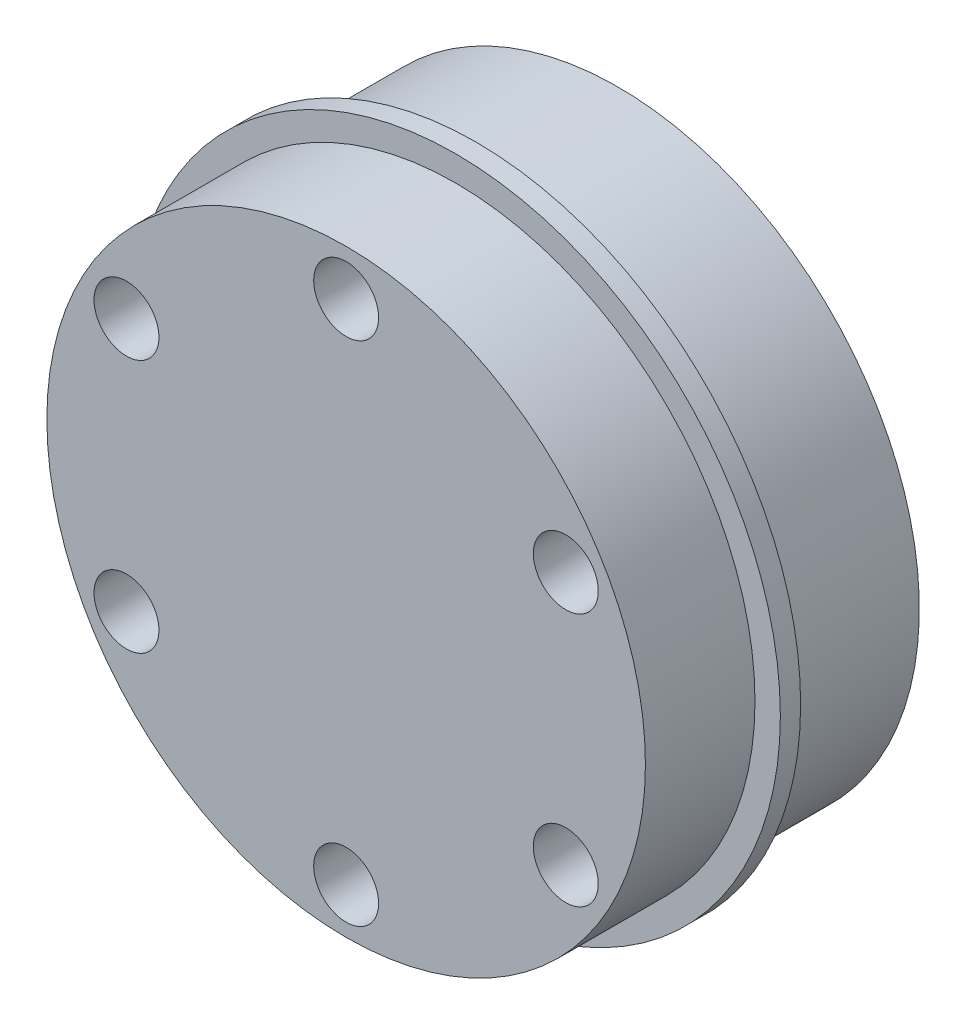
ISO-10303-21;
HEADER;
FILE_DESCRIPTION(('STEP AP214'),'2;1');
FILE_NAME('part.step','',(''),(''),'','','');
FILE_SCHEMA(('AUTOMOTIVE_DESIGN { 1 0 10303 214 1 1 1 1 }'));
ENDSEC;
DATA;
#1=APPLICATION_CONTEXT('core data for automotive mechanical design processes');
#2=APPLICATION_PROTOCOL_DEFINITION('international standard','automotive_design',2000,#1);
#3=PRODUCT_CONTEXT('',#1,'mechanical');
#4=PRODUCT('Part','Part','',(#3));
#5=PRODUCT_RELATED_PRODUCT_CATEGORY('part','',(#4));
#6=PRODUCT_DEFINITION_FORMATION('','',#4);
#7=PRODUCT_DEFINITION_CONTEXT('part definition',#1,'design');
#8=PRODUCT_DEFINITION('design','',#6,#7);
#9=PRODUCT_DEFINITION_SHAPE('','',#8);
#10=(LENGTH_UNIT() NAMED_UNIT(*) SI_UNIT(.MILLI.,.METRE.));
#11=(NAMED_UNIT(*) PLANE_ANGLE_UNIT() SI_UNIT($,.RADIAN.));
#12=(NAMED_UNIT(*) SI_UNIT($,.STERADIAN.) SOLID_ANGLE_UNIT());
#13=UNCERTAINTY_MEASURE_WITH_UNIT(LENGTH_MEASURE(1.E-05),#10,'distance_accuracy_value','');
#14=(GEOMETRIC_REPRESENTATION_CONTEXT(3) GLOBAL_UNCERTAINTY_ASSIGNED_CONTEXT((#13)) GLOBAL_UNIT_ASSIGNED_CONTEXT((#10,
#11,#12)) REPRESENTATION_CONTEXT('',''));
#15=CARTESIAN_POINT('',(0.,0.,0.));
#16=DIRECTION('',(0.,0.,1.));
#17=DIRECTION('',(1.,0.,0.));
#18=AXIS2_PLACEMENT_3D('',#15,#16,#17);
#19=CARTESIAN_POINT('',(0.,0.,5.4));
#20=DIRECTION('',(0.,0.,-1.));
#21=DIRECTION('',(-1.,0.,0.));
#22=AXIS2_PLACEMENT_3D('',#19,#20,#21);
#23=CYLINDRICAL_SURFACE('',#22,14.75);
#24=CARTESIAN_POINT('',(0.,0.,5.4));
#25=DIRECTION('',(0.,0.,1.));
#26=DIRECTION('',(1.,0.,0.));
#27=AXIS2_PLACEMENT_3D('',#24,#25,#26);
#28=CIRCLE('',#27,14.75);
#29=CARTESIAN_POINT('',(-14.75,0.,5.4));
#30=VERTEX_POINT('',#29);
#31=EDGE_CURVE('E46',#30,#30,#28,.T.);
#32=CARTESIAN_POINT('',(0.,0.,0.));
#33=DIRECTION('',(0.,0.,1.));
#34=DIRECTION('',(1.,0.,0.));
#35=AXIS2_PLACEMENT_3D('',#32,#33,#34);
#36=CIRCLE('',#35,14.75);
#37=CARTESIAN_POINT('',(-14.75,0.,0.));
#38=VERTEX_POINT('',#37);
#39=EDGE_CURVE('E42',#38,#38,#36,.T.);
#40=CARTESIAN_POINT('',(-14.75,0.,5.4));
#41=CARTESIAN_POINT('',(-14.75,0.,5.34375));
#42=CARTESIAN_POINT('',(-14.75,0.,5.2875));
#43=CARTESIAN_POINT('',(-14.75,0.,5.175));
#44=CARTESIAN_POINT('',(-14.75,0.,5.11875));
#45=CARTESIAN_POINT('',(-14.75,0.,5.00625));
#46=CARTESIAN_POINT('',(-14.75,0.,4.95));
#47=CARTESIAN_POINT('',(-14.75,0.,4.8375));
#48=CARTESIAN_POINT('',(-14.75,0.,4.78125));
#49=CARTESIAN_POINT('',(-14.75,0.,4.66875));
#50=CARTESIAN_POINT('',(-14.75,0.,4.6125));
#51=CARTESIAN_POINT('',(-14.75,0.,4.5));
#52=CARTESIAN_POINT('',(-14.75,0.,4.44375));
#53=CARTESIAN_POINT('',(-14.75,0.,4.33125));
#54=CARTESIAN_POINT('',(-14.75,0.,4.275));
#55=CARTESIAN_POINT('',(-14.75,0.,4.1625));
#56=CARTESIAN_POINT('',(-14.75,0.,4.10625));
#57=CARTESIAN_POINT('',(-14.75,0.,3.99375));
#58=CARTESIAN_POINT('',(-14.75,0.,3.9375));
#59=CARTESIAN_POINT('',(-14.75,0.,3.825));
#60=CARTESIAN_POINT('',(-14.75,0.,3.76875));
#61=CARTESIAN_POINT('',(-14.75,0.,3.65625));
#62=CARTESIAN_POINT('',(-14.75,0.,3.6));
#63=CARTESIAN_POINT('',(-14.75,0.,3.4875));
#64=CARTESIAN_POINT('',(-14.75,0.,3.43125));
#65=CARTESIAN_POINT('',(-14.75,0.,3.31875));
#66=CARTESIAN_POINT('',(-14.75,0.,3.2625));
#67=CARTESIAN_POINT('',(-14.75,0.,3.15));
#68=CARTESIAN_POINT('',(-14.75,0.,3.09375));
#69=CARTESIAN_POINT('',(-14.75,0.,2.98125));
#70=CARTESIAN_POINT('',(-14.75,0.,2.925));
#71=CARTESIAN_POINT('',(-14.75,0.,2.8125));
#72=CARTESIAN_POINT('',(-14.75,0.,2.75625));
#73=CARTESIAN_POINT('',(-14.75,0.,2.64375));
#74=CARTESIAN_POINT('',(-14.75,0.,2.5875));
#75=CARTESIAN_POINT('',(-14.75,0.,2.475));
#76=CARTESIAN_POINT('',(-14.75,0.,2.41875));
#77=CARTESIAN_POINT('',(-14.75,0.,2.30625));
#78=CARTESIAN_POINT('',(-14.75,0.,2.25));
#79=CARTESIAN_POINT('',(-14.75,0.,2.1375));
#80=CARTESIAN_POINT('',(-14.75,0.,2.08125));
#81=CARTESIAN_POINT('',(-14.75,0.,1.96875));
#82=CARTESIAN_POINT('',(-14.75,0.,1.9125));
#83=CARTESIAN_POINT('',(-14.75,0.,1.8));
#84=CARTESIAN_POINT('',(-14.75,0.,1.74375));
#85=CARTESIAN_POINT('',(-14.75,0.,1.63125));
#86=CARTESIAN_POINT('',(-14.75,0.,1.575));
#87=CARTESIAN_POINT('',(-14.75,0.,1.4625));
#88=CARTESIAN_POINT('',(-14.75,0.,1.40625));
#89=CARTESIAN_POINT('',(-14.75,0.,1.29375));
#90=CARTESIAN_POINT('',(-14.75,0.,1.2375));
#91=CARTESIAN_POINT('',(-14.75,0.,1.125));
#92=CARTESIAN_POINT('',(-14.75,0.,1.06875));
#93=CARTESIAN_POINT('',(-14.75,0.,0.956249999999999));
#94=CARTESIAN_POINT('',(-14.75,0.,0.899999999999999));
#95=CARTESIAN_POINT('',(-14.75,0.,0.787499999999999));
#96=CARTESIAN_POINT('',(-14.75,0.,0.731249999999999));
#97=CARTESIAN_POINT('',(-14.75,0.,0.618749999999999));
#98=CARTESIAN_POINT('',(-14.75,0.,0.562499999999999));
#99=CARTESIAN_POINT('',(-14.75,0.,0.449999999999999));
#100=CARTESIAN_POINT('',(-14.75,0.,0.393749999999999));
#101=CARTESIAN_POINT('',(-14.75,0.,0.281249999999999));
#102=CARTESIAN_POINT('',(-14.75,0.,0.224999999999999));
#103=CARTESIAN_POINT('',(-14.75,0.,0.112499999999999));
#104=CARTESIAN_POINT('',(-14.75,0.,0.0562499999999989));
#105=CARTESIAN_POINT('',(-14.75,0.,0.));
#106=B_SPLINE_CURVE_WITH_KNOTS('',3,(#40,#41,#42,#43,#44,#45,#46,#47,#48,#49,#50,#51,#52,#53,
#54,#55,#56,#57,#58,#59,#60,#61,#62,#63,#64,#65,#66,#67,#68,#69,#70,#71,#72,#73,#74,#75,#76,#77,
#78,#79,#80,#81,#82,#83,#84,#85,#86,#87,#88,#89,#90,#91,#92,#93,#94,#95,#96,#97,#98,#99,#100,
#101,#102,#103,#104,#105),.UNSPECIFIED.,.F.,.F.,(4,2,2,2,2,2,2,2,2,2,2,2,2,2,2,2,2,2,2,2,2,2,2,
2,2,2,2,2,2,2,2,2,4),(0.,0.16875,0.337499999999999,0.50625,0.674999999999999,0.84375,1.0125,
1.18125,1.35,1.51875,1.6875,1.85625,2.025,2.19375,2.3625,2.53125,2.7,2.86875,3.0375,3.20625,
3.375,3.54375,3.7125,3.88125,4.05,4.21875,4.3875,4.55625,4.725,4.89375,5.0625,5.23125,5.4),.UNSPECIFIED.);
#107=EDGE_CURVE('BSEAM39',#30,#38,#106,.T.);
#108=ORIENTED_EDGE('',*,*,#31,.F.);
#109=ORIENTED_EDGE('',*,*,#39,.T.);
#110=ORIENTED_EDGE('',*,*,#107,.T.);
#111=ORIENTED_EDGE('',*,*,#107,.F.);
#112=EDGE_LOOP('',(#108,#110,#109,#111));
#113=FACE_BOUND('',#112,.T.);
#114=ADVANCED_FACE('F39',(#113),#23,.T.);
#115=CARTESIAN_POINT('',(0.,0.,5.4));
#116=DIRECTION('',(0.,0.,1.));
#117=DIRECTION('',(1.,0.,0.));
#118=AXIS2_PLACEMENT_3D('',#115,#116,#117);
#119=PLANE('',#118);
#120=CARTESIAN_POINT('',(0.,12.5,5.4));
#121=DIRECTION('',(0.,0.,-1.));
#122=DIRECTION('',(-1.,0.,0.));
#123=AXIS2_PLACEMENT_3D('',#120,#121,#122);
#124=CIRCLE('',#123,1.6);
#125=CARTESIAN_POINT('',(-1.6,12.5,5.4));
#126=VERTEX_POINT('',#125);
#127=EDGE_CURVE('E77',#126,#126,#124,.T.);
#128=ORIENTED_EDGE('',*,*,#127,.T.);
#129=EDGE_LOOP('',(#128));
#130=FACE_BOUND('',#129,.T.);
#131=CARTESIAN_POINT('',(-10.8253175473054,6.25000000000013,5.4));
#132=DIRECTION('',(0.,0.,-1.));
#133=DIRECTION('',(-1.,0.,0.));
#134=AXIS2_PLACEMENT_3D('',#131,#132,#133);
#135=CIRCLE('',#134,1.6);
#136=CARTESIAN_POINT('',(-12.4253175473054,6.25000000000013,5.4));
#137=VERTEX_POINT('',#136);
#138=EDGE_CURVE('E83',#137,#137,#135,.T.);
#139=ORIENTED_EDGE('',*,*,#138,.T.);
#140=EDGE_LOOP('',(#139));
#141=FACE_BOUND('',#140,.T.);
#142=CARTESIAN_POINT('',(0.,-12.5,5.4));
#143=DIRECTION('',(0.,0.,-1.));
#144=DIRECTION('',(-1.,0.,0.));
#145=AXIS2_PLACEMENT_3D('',#142,#143,#144);
#146=CIRCLE('',#145,1.6);
#147=CARTESIAN_POINT('',(-1.60000000000009,-12.5,5.4));
#148=VERTEX_POINT('',#147);
#149=EDGE_CURVE('E89',#148,#148,#146,.T.);
#150=ORIENTED_EDGE('',*,*,#149,.T.);
#151=EDGE_LOOP('',(#150));
#152=FACE_BOUND('',#151,.T.);
#153=CARTESIAN_POINT('',(10.8253175473055,-6.25000000000005,5.4));
#154=DIRECTION('',(0.,0.,-1.));
#155=DIRECTION('',(-1.,0.,0.));
#156=AXIS2_PLACEMENT_3D('',#153,#154,#155);
#157=CIRCLE('',#156,1.6);
#158=CARTESIAN_POINT('',(9.22531754730546,-6.25000000000005,5.4));
#159=VERTEX_POINT('',#158);
#160=EDGE_CURVE('E95',#159,#159,#157,.T.);
#161=ORIENTED_EDGE('',*,*,#160,.T.);
#162=EDGE_LOOP('',(#161));
#163=FACE_BOUND('',#162,.T.);
#164=CARTESIAN_POINT('',(10.8253175473055,6.24999999999998,5.4));
#165=DIRECTION('',(0.,0.,-1.));
#166=DIRECTION('',(-1.,0.,0.));
#167=AXIS2_PLACEMENT_3D('',#164,#165,#166);
#168=CIRCLE('',#167,1.6);
#169=CARTESIAN_POINT('',(9.2253175473055,6.24999999999998,5.4));
#170=VERTEX_POINT('',#169);
#171=EDGE_CURVE('E72',#170,#170,#168,.T.);
#172=ORIENTED_EDGE('',*,*,#171,.T.);
#173=EDGE_LOOP('',(#172));
#174=FACE_BOUND('',#173,.T.);
#175=CARTESIAN_POINT('',(-10.8253175473055,-6.2499999999999,5.4));
#176=DIRECTION('',(0.,0.,-1.));
#177=DIRECTION('',(-1.,0.,0.));
#178=AXIS2_PLACEMENT_3D('',#175,#176,#177);
#179=CIRCLE('',#178,1.6);
#180=CARTESIAN_POINT('',(-12.4253175473055,-6.2499999999999,5.4));
#181=VERTEX_POINT('',#180);
#182=EDGE_CURVE('E67',#181,#181,#179,.T.);
#183=ORIENTED_EDGE('',*,*,#182,.T.);
#184=EDGE_LOOP('',(#183));
#185=FACE_BOUND('',#184,.T.);
#186=ORIENTED_EDGE('',*,*,#31,.T.);
#187=EDGE_LOOP('',(#186));
#188=FACE_BOUND('',#187,.T.);
#189=ADVANCED_FACE('F104',(#130,#141,#152,#163,#174,#185,#188),#119,.T.);
#190=CARTESIAN_POINT('',(0.,0.,-1.));
#191=DIRECTION('',(0.,0.,1.));
#192=DIRECTION('',(1.,0.,0.));
#193=AXIS2_PLACEMENT_3D('',#190,#191,#192);
#194=CYLINDRICAL_SURFACE('',#193,16.);
#195=CARTESIAN_POINT('',(0.,0.,-1.));
#196=DIRECTION('',(0.,0.,-1.));
#197=DIRECTION('',(-1.,0.,0.));
#198=AXIS2_PLACEMENT_3D('',#195,#196,#197);
#199=CIRCLE('',#198,16.);
#200=CARTESIAN_POINT('',(-16.,0.,-1.));
#201=VERTEX_POINT('',#200);
#202=EDGE_CURVE('E55',#201,#201,#199,.T.);
#203=ORIENTED_EDGE('',*,*,#202,.F.);
#204=EDGE_LOOP('',(#203));
#205=FACE_BOUND('',#204,.T.);
#206=CARTESIAN_POINT('',(0.,0.,0.));
#207=DIRECTION('',(0.,0.,-1.));
#208=DIRECTION('',(-1.,0.,0.));
#209=AXIS2_PLACEMENT_3D('',#206,#207,#208);
#210=CIRCLE('',#209,16.);
#211=CARTESIAN_POINT('',(-16.,0.,0.));
#212=VERTEX_POINT('',#211);
#213=EDGE_CURVE('E58',#212,#212,#210,.T.);
#214=ORIENTED_EDGE('',*,*,#213,.T.);
#215=EDGE_LOOP('',(#214));
#216=FACE_BOUND('',#215,.T.);
#217=ADVANCED_FACE('F128',(#205,#216),#194,.T.);
#218=CARTESIAN_POINT('',(0.,0.,-1.));
#219=DIRECTION('',(0.,0.,-1.));
#220=DIRECTION('',(-1.,0.,0.));
#221=AXIS2_PLACEMENT_3D('',#218,#219,#220);
#222=PLANE('',#221);
#223=CARTESIAN_POINT('',(0.,0.,-1.));
#224=DIRECTION('',(0.,0.,-1.));
#225=DIRECTION('',(-1.,0.,0.));
#226=AXIS2_PLACEMENT_3D('',#223,#224,#225);
#227=CIRCLE('',#226,14.85);
#228=CARTESIAN_POINT('',(-14.85,0.,-1.));
#229=VERTEX_POINT('',#228);
#230=EDGE_CURVE('E10',#229,#229,#227,.T.);
#231=ORIENTED_EDGE('',*,*,#230,.F.);
#232=EDGE_LOOP('',(#231));
#233=FACE_BOUND('',#232,.T.);
#234=ORIENTED_EDGE('',*,*,#202,.T.);
#235=EDGE_LOOP('',(#234));
#236=FACE_BOUND('',#235,.T.);
#237=ADVANCED_FACE('F139',(#233,#236),#222,.T.);
#238=CARTESIAN_POINT('',(0.,0.,0.));
#239=DIRECTION('',(0.,0.,-1.));
#240=DIRECTION('',(-1.,0.,0.));
#241=AXIS2_PLACEMENT_3D('',#238,#239,#240);
#242=PLANE('',#241);
#243=ORIENTED_EDGE('',*,*,#39,.F.);
#244=EDGE_LOOP('',(#243));
#245=FACE_BOUND('',#244,.T.);
#246=ORIENTED_EDGE('',*,*,#213,.F.);
#247=EDGE_LOOP('',(#246));
#248=FACE_BOUND('',#247,.T.);
#249=ADVANCED_FACE('F135',(#245,#248),#242,.F.);
#250=CARTESIAN_POINT('',(0.,0.,-8.));
#251=DIRECTION('',(0.,0.,1.));
#252=DIRECTION('',(1.,0.,0.));
#253=AXIS2_PLACEMENT_3D('',#250,#251,#252);
#254=CYLINDRICAL_SURFACE('',#253,14.85);
#255=CARTESIAN_POINT('',(0.,0.,-8.));
#256=DIRECTION('',(0.,0.,-1.));
#257=DIRECTION('',(-1.,0.,0.));
#258=AXIS2_PLACEMENT_3D('',#255,#256,#257);
#259=CIRCLE('',#258,14.85);
#260=CARTESIAN_POINT('',(-14.85,0.,-8.));
#261=VERTEX_POINT('',#260);
#262=EDGE_CURVE('E53',#261,#261,#259,.T.);
#263=ORIENTED_EDGE('',*,*,#262,.F.);
#264=EDGE_LOOP('',(#263));
#265=FACE_BOUND('',#264,.T.);
#266=ORIENTED_EDGE('',*,*,#230,.T.);
#267=EDGE_LOOP('',(#266));
#268=FACE_BOUND('',#267,.T.);
#269=ADVANCED_FACE('F138',(#265,#268),#254,.T.);
#270=CARTESIAN_POINT('',(0.,0.,-8.));
#271=DIRECTION('',(0.,0.,-1.));
#272=DIRECTION('',(-1.,0.,0.));
#273=AXIS2_PLACEMENT_3D('',#270,#271,#272);
#274=PLANE('',#273);
#275=CARTESIAN_POINT('',(0.,12.5,-8.));
#276=DIRECTION('',(0.,0.,-1.));
#277=DIRECTION('',(-1.,0.,0.));
#278=AXIS2_PLACEMENT_3D('',#275,#276,#277);
#279=CIRCLE('',#278,1.6);
#280=CARTESIAN_POINT('',(-1.6,12.5,-8.));
#281=VERTEX_POINT('',#280);
#282=EDGE_CURVE('E74',#281,#281,#279,.T.);
#283=ORIENTED_EDGE('',*,*,#282,.F.);
#284=EDGE_LOOP('',(#283));
#285=FACE_BOUND('',#284,.T.);
#286=CARTESIAN_POINT('',(-10.8253175473054,6.25000000000013,-8.));
#287=DIRECTION('',(0.,0.,-1.));
#288=DIRECTION('',(-1.,0.,0.));
#289=AXIS2_PLACEMENT_3D('',#286,#287,#288);
#290=CIRCLE('',#289,1.6);
#291=CARTESIAN_POINT('',(-12.4253175473054,6.25000000000013,-8.));
#292=VERTEX_POINT('',#291);
#293=EDGE_CURVE('E80',#292,#292,#290,.T.);
#294=ORIENTED_EDGE('',*,*,#293,.F.);
#295=EDGE_LOOP('',(#294));
#296=FACE_BOUND('',#295,.T.);
#297=CARTESIAN_POINT('',(0.,-12.5,-8.));
#298=DIRECTION('',(0.,0.,-1.));
#299=DIRECTION('',(-1.,0.,0.));
#300=AXIS2_PLACEMENT_3D('',#297,#298,#299);
#301=CIRCLE('',#300,1.6);
#302=CARTESIAN_POINT('',(-1.60000000000009,-12.5,-8.));
#303=VERTEX_POINT('',#302);
#304=EDGE_CURVE('E86',#303,#303,#301,.T.);
#305=ORIENTED_EDGE('',*,*,#304,.F.);
#306=EDGE_LOOP('',(#305));
#307=FACE_BOUND('',#306,.T.);
#308=CARTESIAN_POINT('',(10.8253175473055,-6.25000000000005,-8.));
#309=DIRECTION('',(0.,0.,-1.));
#310=DIRECTION('',(-1.,0.,0.));
#311=AXIS2_PLACEMENT_3D('',#308,#309,#310);
#312=CIRCLE('',#311,1.6);
#313=CARTESIAN_POINT('',(9.22531754730546,-6.25000000000005,-8.));
#314=VERTEX_POINT('',#313);
#315=EDGE_CURVE('E92',#314,#314,#312,.T.);
#316=ORIENTED_EDGE('',*,*,#315,.F.);
#317=EDGE_LOOP('',(#316));
#318=FACE_BOUND('',#317,.T.);
#319=CARTESIAN_POINT('',(10.8253175473055,6.24999999999998,-8.));
#320=DIRECTION('',(0.,0.,-1.));
#321=DIRECTION('',(-1.,0.,0.));
#322=AXIS2_PLACEMENT_3D('',#319,#320,#321);
#323=CIRCLE('',#322,1.6);
#324=CARTESIAN_POINT('',(9.2253175473055,6.24999999999998,-8.));
#325=VERTEX_POINT('',#324);
#326=EDGE_CURVE('E98',#325,#325,#323,.T.);
#327=ORIENTED_EDGE('',*,*,#326,.F.);
#328=EDGE_LOOP('',(#327));
#329=FACE_BOUND('',#328,.T.);
#330=CARTESIAN_POINT('',(-10.8253175473055,-6.2499999999999,-8.));
#331=DIRECTION('',(0.,0.,-1.));
#332=DIRECTION('',(-1.,0.,0.));
#333=AXIS2_PLACEMENT_3D('',#330,#331,#332);
#334=CIRCLE('',#333,1.6);
#335=CARTESIAN_POINT('',(-12.4253175473055,-6.2499999999999,-8.));
#336=VERTEX_POINT('',#335);
#337=EDGE_CURVE('E63',#336,#336,#334,.T.);
#338=ORIENTED_EDGE('',*,*,#337,.F.);
#339=EDGE_LOOP('',(#338));
#340=FACE_BOUND('',#339,.T.);
#341=ORIENTED_EDGE('',*,*,#262,.T.);
#342=EDGE_LOOP('',(#341));
#343=FACE_BOUND('',#342,.T.);
#344=ADVANCED_FACE('F120',(#285,#296,#307,#318,#329,#340,#343),#274,.T.);
#345=CARTESIAN_POINT('',(-10.8253175473055,-6.2499999999999,-8.));
#346=DIRECTION('',(0.,0.,1.));
#347=DIRECTION('',(1.,0.,0.));
#348=AXIS2_PLACEMENT_3D('',#345,#346,#347);
#349=CYLINDRICAL_SURFACE('',#348,1.6);
#350=ORIENTED_EDGE('',*,*,#337,.T.);
#351=EDGE_LOOP('',(#350));
#352=FACE_BOUND('',#351,.T.);
#353=ORIENTED_EDGE('',*,*,#182,.F.);
#354=EDGE_LOOP('',(#353));
#355=FACE_BOUND('',#354,.T.);
#356=ADVANCED_FACE('F110',(#352,#355),#349,.F.);
#357=CARTESIAN_POINT('',(10.8253175473055,6.24999999999998,-8.));
#358=DIRECTION('',(0.,0.,1.));
#359=DIRECTION('',(1.,0.,0.));
#360=AXIS2_PLACEMENT_3D('',#357,#358,#359);
#361=CYLINDRICAL_SURFACE('',#360,1.6);
#362=ORIENTED_EDGE('',*,*,#326,.T.);
#363=EDGE_LOOP('',(#362));
#364=FACE_BOUND('',#363,.T.);
#365=ORIENTED_EDGE('',*,*,#171,.F.);
#366=EDGE_LOOP('',(#365));
#367=FACE_BOUND('',#366,.T.);
#368=ADVANCED_FACE('F107',(#364,#367),#361,.F.);
#369=CARTESIAN_POINT('',(10.8253175473055,-6.25000000000005,-8.));
#370=DIRECTION('',(0.,0.,1.));
#371=DIRECTION('',(1.,0.,0.));
#372=AXIS2_PLACEMENT_3D('',#369,#370,#371);
#373=CYLINDRICAL_SURFACE('',#372,1.6);
#374=ORIENTED_EDGE('',*,*,#315,.T.);
#375=EDGE_LOOP('',(#374));
#376=FACE_BOUND('',#375,.T.);
#377=ORIENTED_EDGE('',*,*,#160,.F.);
#378=EDGE_LOOP('',(#377));
#379=FACE_BOUND('',#378,.T.);
#380=ADVANCED_FACE('F109',(#376,#379),#373,.F.);
#381=CARTESIAN_POINT('',(0.,-12.5,-8.));
#382=DIRECTION('',(0.,0.,1.));
#383=DIRECTION('',(1.,0.,0.));
#384=AXIS2_PLACEMENT_3D('',#381,#382,#383);
#385=CYLINDRICAL_SURFACE('',#384,1.6);
#386=ORIENTED_EDGE('',*,*,#304,.T.);
#387=EDGE_LOOP('',(#386));
#388=FACE_BOUND('',#387,.T.);
#389=ORIENTED_EDGE('',*,*,#149,.F.);
#390=EDGE_LOOP('',(#389));
#391=FACE_BOUND('',#390,.T.);
#392=ADVANCED_FACE('F117',(#388,#391),#385,.F.);
#393=CARTESIAN_POINT('',(-10.8253175473054,6.25000000000013,-8.));
#394=DIRECTION('',(0.,0.,1.));
#395=DIRECTION('',(1.,0.,0.));
#396=AXIS2_PLACEMENT_3D('',#393,#394,#395);
#397=CYLINDRICAL_SURFACE('',#396,1.6);
#398=ORIENTED_EDGE('',*,*,#293,.T.);
#399=EDGE_LOOP('',(#398));
#400=FACE_BOUND('',#399,.T.);
#401=ORIENTED_EDGE('',*,*,#138,.F.);
#402=EDGE_LOOP('',(#401));
#403=FACE_BOUND('',#402,.T.);
#404=ADVANCED_FACE('F210',(#400,#403),#397,.F.);
#405=CARTESIAN_POINT('',(0.,12.5,-8.));
#406=DIRECTION('',(0.,0.,1.));
#407=DIRECTION('',(1.,0.,0.));
#408=AXIS2_PLACEMENT_3D('',#405,#406,#407);
#409=CYLINDRICAL_SURFACE('',#408,1.6);
#410=ORIENTED_EDGE('',*,*,#282,.T.);
#411=EDGE_LOOP('',(#410));
#412=FACE_BOUND('',#411,.T.);
#413=ORIENTED_EDGE('',*,*,#127,.F.);
#414=EDGE_LOOP('',(#413));
#415=FACE_BOUND('',#414,.T.);
#416=ADVANCED_FACE('F220',(#412,#415),#409,.F.);
#417=CLOSED_SHELL('',(#114,#189,#217,#237,#249,#269,#344,#356,#368,#380,#392,#404,#416));
#418=MANIFOLD_SOLID_BREP('B2',#417);
#419=ADVANCED_BREP_SHAPE_REPRESENTATION('',(#18,#418),#14);
#420=SHAPE_DEFINITION_REPRESENTATION(#9,#419);
ENDSEC;
END-ISO-10303-21;
